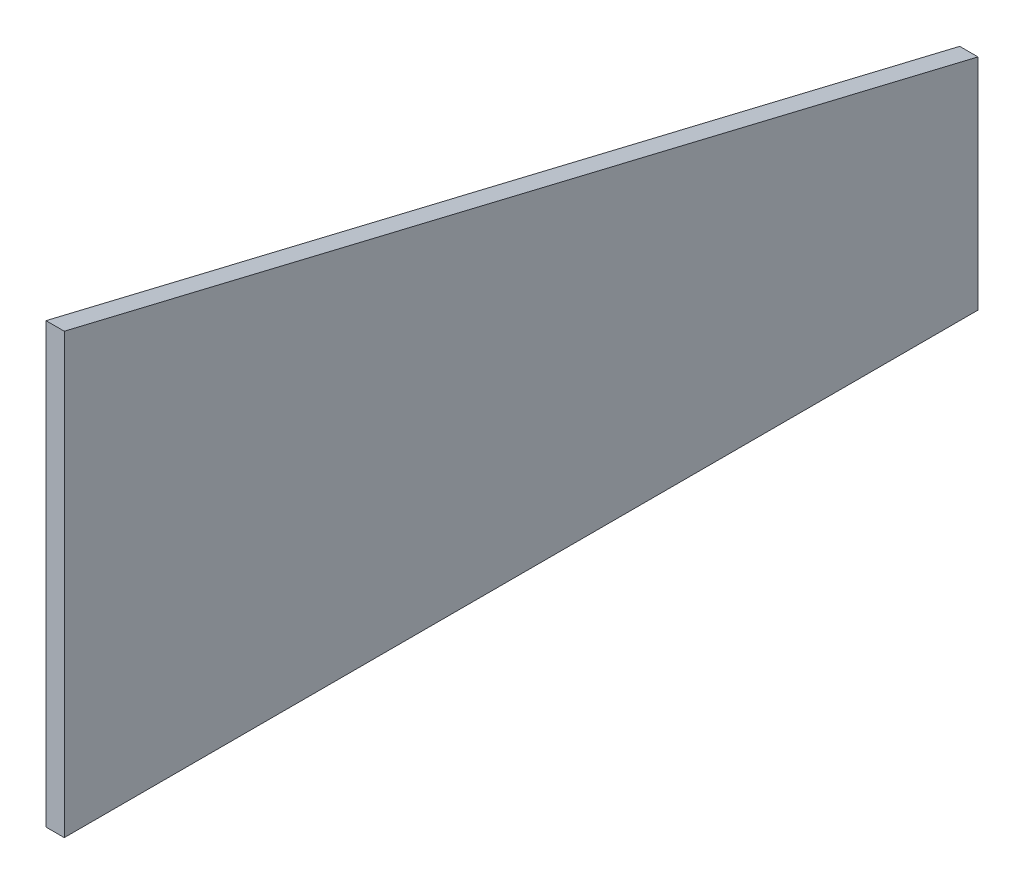
ISO-10303-21;
HEADER;
FILE_DESCRIPTION(('STEP AP214'),'2;1');
FILE_NAME('part.step','',(''),(''),'','','');
FILE_SCHEMA(('AUTOMOTIVE_DESIGN { 1 0 10303 214 1 1 1 1 }'));
ENDSEC;
DATA;
#1=APPLICATION_CONTEXT('core data for automotive mechanical design processes');
#2=APPLICATION_PROTOCOL_DEFINITION('international standard','automotive_design',2000,#1);
#3=PRODUCT_CONTEXT('',#1,'mechanical');
#4=PRODUCT('Part','Part','',(#3));
#5=PRODUCT_RELATED_PRODUCT_CATEGORY('part','',(#4));
#6=PRODUCT_DEFINITION_FORMATION('','',#4);
#7=PRODUCT_DEFINITION_CONTEXT('part definition',#1,'design');
#8=PRODUCT_DEFINITION('design','',#6,#7);
#9=PRODUCT_DEFINITION_SHAPE('','',#8);
#10=(LENGTH_UNIT() NAMED_UNIT(*) SI_UNIT(.MILLI.,.METRE.));
#11=(NAMED_UNIT(*) PLANE_ANGLE_UNIT() SI_UNIT($,.RADIAN.));
#12=(NAMED_UNIT(*) SI_UNIT($,.STERADIAN.) SOLID_ANGLE_UNIT());
#13=UNCERTAINTY_MEASURE_WITH_UNIT(LENGTH_MEASURE(1.E-05),#10,'distance_accuracy_value','');
#14=(GEOMETRIC_REPRESENTATION_CONTEXT(3) GLOBAL_UNCERTAINTY_ASSIGNED_CONTEXT((#13)) GLOBAL_UNIT_ASSIGNED_CONTEXT((#10,
#11,#12)) REPRESENTATION_CONTEXT('',''));
#15=CARTESIAN_POINT('',(0.,0.,0.));
#16=DIRECTION('',(0.,0.,1.));
#17=DIRECTION('',(1.,0.,0.));
#18=AXIS2_PLACEMENT_3D('',#15,#16,#17);
#19=CARTESIAN_POINT('',(6.35,0.,0.));
#20=DIRECTION('',(0.,0.,-1.));
#21=DIRECTION('',(-1.,0.,0.));
#22=AXIS2_PLACEMENT_3D('',#19,#20,#21);
#23=PLANE('',#22);
#24=DIRECTION('',(0.,-1.,0.));
#25=VECTOR('',#24,1.);
#26=CARTESIAN_POINT('',(0.,0.,0.));
#27=LINE('',#26,#25);
#28=CARTESIAN_POINT('',(0.,152.4,0.));
#29=VERTEX_POINT('',#28);
#30=CARTESIAN_POINT('',(0.,0.,0.));
#31=VERTEX_POINT('',#30);
#32=EDGE_CURVE('E96',#29,#31,#27,.T.);
#33=ORIENTED_EDGE('',*,*,#32,.T.);
#34=DIRECTION('',(-1.,0.,0.));
#35=VECTOR('',#34,1.);
#36=CARTESIAN_POINT('',(6.35,0.,0.));
#37=LINE('',#36,#35);
#38=CARTESIAN_POINT('',(6.35,0.,0.));
#39=VERTEX_POINT('',#38);
#40=EDGE_CURVE('E11',#39,#31,#37,.T.);
#41=ORIENTED_EDGE('',*,*,#40,.F.);
#42=DIRECTION('',(0.,-1.,0.));
#43=VECTOR('',#42,1.);
#44=CARTESIAN_POINT('',(6.35,0.,0.));
#45=LINE('',#44,#43);
#46=CARTESIAN_POINT('',(6.35,152.4,0.));
#47=VERTEX_POINT('',#46);
#48=EDGE_CURVE('E84',#47,#39,#45,.T.);
#49=ORIENTED_EDGE('',*,*,#48,.F.);
#50=DIRECTION('',(-1.,0.,0.));
#51=VECTOR('',#50,1.);
#52=CARTESIAN_POINT('',(6.35,152.4,0.));
#53=LINE('',#52,#51);
#54=EDGE_CURVE('E92',#47,#29,#53,.T.);
#55=ORIENTED_EDGE('',*,*,#54,.T.);
#56=EDGE_LOOP('',(#33,#41,#49,#55));
#57=FACE_BOUND('',#56,.T.);
#58=ADVANCED_FACE('F33',(#57),#23,.F.);
#59=CARTESIAN_POINT('',(6.35,0.,0.));
#60=DIRECTION('',(0.,1.,0.));
#61=DIRECTION('',(0.,0.,1.));
#62=AXIS2_PLACEMENT_3D('',#59,#60,#61);
#63=PLANE('',#62);
#64=DIRECTION('',(0.,0.,-1.));
#65=VECTOR('',#64,1.);
#66=CARTESIAN_POINT('',(0.,0.,0.));
#67=LINE('',#66,#65);
#68=CARTESIAN_POINT('',(0.,0.,-317.5));
#69=VERTEX_POINT('',#68);
#70=EDGE_CURVE('E88',#31,#69,#67,.T.);
#71=ORIENTED_EDGE('',*,*,#70,.T.);
#72=DIRECTION('',(-1.,0.,0.));
#73=VECTOR('',#72,1.);
#74=CARTESIAN_POINT('',(6.35,0.,-317.5));
#75=LINE('',#74,#73);
#76=CARTESIAN_POINT('',(6.35,0.,-317.5));
#77=VERTEX_POINT('',#76);
#78=EDGE_CURVE('E41',#77,#69,#75,.T.);
#79=ORIENTED_EDGE('',*,*,#78,.F.);
#80=DIRECTION('',(0.,0.,-1.));
#81=VECTOR('',#80,1.);
#82=CARTESIAN_POINT('',(6.35,0.,0.));
#83=LINE('',#82,#81);
#84=EDGE_CURVE('E79',#39,#77,#83,.T.);
#85=ORIENTED_EDGE('',*,*,#84,.F.);
#86=ORIENTED_EDGE('',*,*,#40,.T.);
#87=EDGE_LOOP('',(#71,#79,#85,#86));
#88=FACE_BOUND('',#87,.T.);
#89=ADVANCED_FACE('F87',(#88),#63,.F.);
#90=CARTESIAN_POINT('',(6.35,0.,-317.5));
#91=DIRECTION('',(0.,0.,1.));
#92=DIRECTION('',(1.,0.,0.));
#93=AXIS2_PLACEMENT_3D('',#90,#91,#92);
#94=PLANE('',#93);
#95=DIRECTION('',(0.,1.,0.));
#96=VECTOR('',#95,1.);
#97=CARTESIAN_POINT('',(0.,0.,-317.5));
#98=LINE('',#97,#96);
#99=CARTESIAN_POINT('',(0.,76.2,-317.5));
#100=VERTEX_POINT('',#99);
#101=EDGE_CURVE('E66',#69,#100,#98,.T.);
#102=ORIENTED_EDGE('',*,*,#101,.T.);
#103=DIRECTION('',(-1.,0.,0.));
#104=VECTOR('',#103,1.);
#105=CARTESIAN_POINT('',(6.35,76.2,-317.5));
#106=LINE('',#105,#104);
#107=CARTESIAN_POINT('',(6.35,76.2,-317.5));
#108=VERTEX_POINT('',#107);
#109=EDGE_CURVE('E89',#108,#100,#106,.T.);
#110=ORIENTED_EDGE('',*,*,#109,.F.);
#111=DIRECTION('',(0.,1.,0.));
#112=VECTOR('',#111,1.);
#113=CARTESIAN_POINT('',(6.35,0.,-317.5));
#114=LINE('',#113,#112);
#115=EDGE_CURVE('E82',#77,#108,#114,.T.);
#116=ORIENTED_EDGE('',*,*,#115,.F.);
#117=ORIENTED_EDGE('',*,*,#78,.T.);
#118=EDGE_LOOP('',(#102,#110,#116,#117));
#119=FACE_BOUND('',#118,.T.);
#120=ADVANCED_FACE('F90',(#119),#94,.F.);
#121=CARTESIAN_POINT('',(6.35,152.4,0.));
#122=DIRECTION('',(0.,-0.972387301980517,0.233372952475324));
#123=DIRECTION('',(0.,-0.233372952475324,-0.972387301980518));
#124=AXIS2_PLACEMENT_3D('',#121,#122,#123);
#125=PLANE('',#124);
#126=DIRECTION('',(0.,0.233372952475324,0.972387301980517));
#127=VECTOR('',#126,1.);
#128=CARTESIAN_POINT('',(0.,152.4,0.));
#129=LINE('',#128,#127);
#130=EDGE_CURVE('E72',#100,#29,#129,.T.);
#131=ORIENTED_EDGE('',*,*,#130,.T.);
#132=ORIENTED_EDGE('',*,*,#54,.F.);
#133=DIRECTION('',(0.,0.233372952475324,0.972387301980517));
#134=VECTOR('',#133,1.);
#135=CARTESIAN_POINT('',(6.35,152.4,0.));
#136=LINE('',#135,#134);
#137=EDGE_CURVE('E49',#108,#47,#136,.T.);
#138=ORIENTED_EDGE('',*,*,#137,.F.);
#139=ORIENTED_EDGE('',*,*,#109,.T.);
#140=EDGE_LOOP('',(#131,#132,#138,#139));
#141=FACE_BOUND('',#140,.T.);
#142=ADVANCED_FACE('F103',(#141),#125,.F.);
#143=CARTESIAN_POINT('',(6.35,0.,0.));
#144=DIRECTION('',(-1.,0.,0.));
#145=DIRECTION('',(0.,0.,1.));
#146=AXIS2_PLACEMENT_3D('',#143,#144,#145);
#147=PLANE('',#146);
#148=ORIENTED_EDGE('',*,*,#48,.T.);
#149=ORIENTED_EDGE('',*,*,#84,.T.);
#150=ORIENTED_EDGE('',*,*,#115,.T.);
#151=ORIENTED_EDGE('',*,*,#137,.T.);
#152=EDGE_LOOP('',(#148,#149,#150,#151));
#153=FACE_BOUND('',#152,.T.);
#154=ADVANCED_FACE('F80',(#153),#147,.F.);
#155=CARTESIAN_POINT('',(0.,0.,0.));
#156=DIRECTION('',(-1.,0.,0.));
#157=DIRECTION('',(0.,0.,1.));
#158=AXIS2_PLACEMENT_3D('',#155,#156,#157);
#159=PLANE('',#158);
#160=ORIENTED_EDGE('',*,*,#32,.F.);
#161=ORIENTED_EDGE('',*,*,#130,.F.);
#162=ORIENTED_EDGE('',*,*,#101,.F.);
#163=ORIENTED_EDGE('',*,*,#70,.F.);
#164=EDGE_LOOP('',(#160,#161,#162,#163));
#165=FACE_BOUND('',#164,.T.);
#166=ADVANCED_FACE('F106',(#165),#159,.T.);
#167=CLOSED_SHELL('',(#58,#89,#120,#142,#154,#166));
#168=MANIFOLD_SOLID_BREP('B2',#167);
#169=ADVANCED_BREP_SHAPE_REPRESENTATION('',(#18,#168),#14);
#170=SHAPE_DEFINITION_REPRESENTATION(#9,#169);
ENDSEC;
END-ISO-10303-21;
